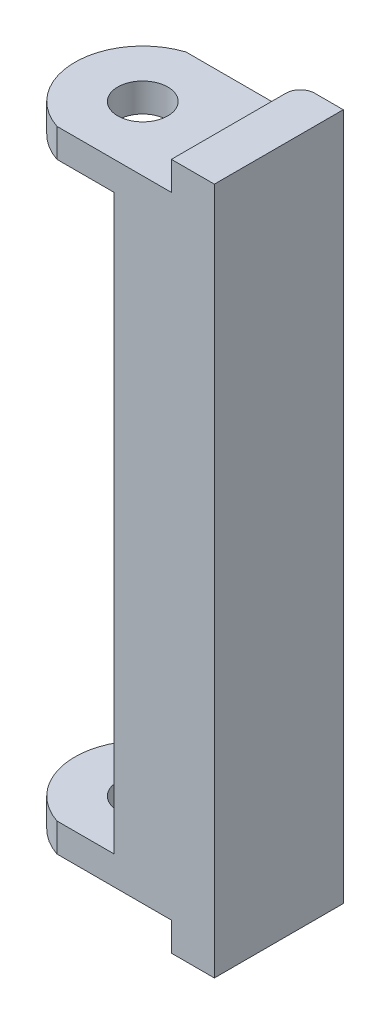
ISO-10303-21;
HEADER;
FILE_DESCRIPTION(('STEP AP214'),'2;1');
FILE_NAME('part.step','',(''),(''),'','','');
FILE_SCHEMA(('AUTOMOTIVE_DESIGN { 1 0 10303 214 1 1 1 1 }'));
ENDSEC;
DATA;
#1=APPLICATION_CONTEXT('core data for automotive mechanical design processes');
#2=APPLICATION_PROTOCOL_DEFINITION('international standard','automotive_design',2000,#1);
#3=PRODUCT_CONTEXT('',#1,'mechanical');
#4=PRODUCT('Part','Part','',(#3));
#5=PRODUCT_RELATED_PRODUCT_CATEGORY('part','',(#4));
#6=PRODUCT_DEFINITION_FORMATION('','',#4);
#7=PRODUCT_DEFINITION_CONTEXT('part definition',#1,'design');
#8=PRODUCT_DEFINITION('design','',#6,#7);
#9=PRODUCT_DEFINITION_SHAPE('','',#8);
#10=(LENGTH_UNIT() NAMED_UNIT(*) SI_UNIT(.MILLI.,.METRE.));
#11=(NAMED_UNIT(*) PLANE_ANGLE_UNIT() SI_UNIT($,.RADIAN.));
#12=(NAMED_UNIT(*) SI_UNIT($,.STERADIAN.) SOLID_ANGLE_UNIT());
#13=UNCERTAINTY_MEASURE_WITH_UNIT(LENGTH_MEASURE(1.E-05),#10,'distance_accuracy_value','');
#14=(GEOMETRIC_REPRESENTATION_CONTEXT(3) GLOBAL_UNCERTAINTY_ASSIGNED_CONTEXT((#13)) GLOBAL_UNIT_ASSIGNED_CONTEXT((#10,
#11,#12)) REPRESENTATION_CONTEXT('',''));
#15=CARTESIAN_POINT('',(0.,0.,0.));
#16=DIRECTION('',(0.,0.,1.));
#17=DIRECTION('',(1.,0.,0.));
#18=AXIS2_PLACEMENT_3D('',#15,#16,#17);
#19=CARTESIAN_POINT('',(0.,2.,0.));
#20=DIRECTION('',(0.,1.,0.));
#21=DIRECTION('',(0.,0.,1.));
#22=AXIS2_PLACEMENT_3D('',#19,#20,#21);
#23=PLANE('',#22);
#24=CARTESIAN_POINT('',(-2.5,2.,0.));
#25=DIRECTION('',(0.,1.,0.));
#26=DIRECTION('',(0.,0.,1.));
#27=AXIS2_PLACEMENT_3D('',#24,#25,#26);
#28=CIRCLE('',#27,1.75);
#29=CARTESIAN_POINT('',(-2.5,2.,1.75));
#30=VERTEX_POINT('',#29);
#31=EDGE_CURVE('E298',#30,#30,#28,.T.);
#32=ORIENTED_EDGE('',*,*,#31,.F.);
#33=EDGE_LOOP('',(#32));
#34=FACE_BOUND('',#33,.T.);
#35=DIRECTION('',(0.,0.,1.));
#36=VECTOR('',#35,1.);
#37=CARTESIAN_POINT('',(4.,2.,0.));
#38=LINE('',#37,#36);
#39=CARTESIAN_POINT('',(4.,2.,-3.5));
#40=VERTEX_POINT('',#39);
#41=CARTESIAN_POINT('',(4.,2.,4.5));
#42=VERTEX_POINT('',#41);
#43=EDGE_CURVE('E103',#40,#42,#38,.T.);
#44=ORIENTED_EDGE('',*,*,#43,.F.);
#45=CARTESIAN_POINT('',(5.,2.,-3.5));
#46=DIRECTION('',(0.,1.,0.));
#47=DIRECTION('',(0.,0.,1.));
#48=AXIS2_PLACEMENT_3D('',#45,#46,#47);
#49=CIRCLE('',#48,1.);
#50=CARTESIAN_POINT('',(5.,2.,-4.5));
#51=VERTEX_POINT('',#50);
#52=EDGE_CURVE('E12',#40,#51,#49,.F.);
#53=ORIENTED_EDGE('',*,*,#52,.T.);
#54=DIRECTION('',(1.,0.,0.));
#55=VECTOR('',#54,1.);
#56=CARTESIAN_POINT('',(0.,2.,-4.5));
#57=LINE('',#56,#55);
#58=CARTESIAN_POINT('',(-3.99100808545272,2.,-4.5));
#59=VERTEX_POINT('',#58);
#60=EDGE_CURVE('E293',#59,#51,#57,.T.);
#61=ORIENTED_EDGE('',*,*,#60,.F.);
#62=CARTESIAN_POINT('',(-2.5,2.,0.));
#63=DIRECTION('',(0.,1.,0.));
#64=DIRECTION('',(0.,0.,1.));
#65=AXIS2_PLACEMENT_3D('',#62,#63,#64);
#66=CIRCLE('',#65,4.74058067233175);
#67=CARTESIAN_POINT('',(-3.99100808545272,2.,4.5));
#68=VERTEX_POINT('',#67);
#69=EDGE_CURVE('E296',#59,#68,#66,.T.);
#70=ORIENTED_EDGE('',*,*,#69,.T.);
#71=DIRECTION('',(1.,0.,0.));
#72=VECTOR('',#71,1.);
#73=CARTESIAN_POINT('',(0.,2.,4.5));
#74=LINE('',#73,#72);
#75=EDGE_CURVE('E291',#68,#42,#74,.T.);
#76=ORIENTED_EDGE('',*,*,#75,.T.);
#77=EDGE_LOOP('',(#44,#53,#61,#70,#76));
#78=FACE_BOUND('',#77,.T.);
#79=ADVANCED_FACE('F95',(#34,#78),#23,.T.);
#80=CARTESIAN_POINT('',(0.,0.,0.));
#81=DIRECTION('',(0.,1.,0.));
#82=DIRECTION('',(0.,0.,1.));
#83=AXIS2_PLACEMENT_3D('',#80,#81,#82);
#84=PLANE('',#83);
#85=CARTESIAN_POINT('',(-2.5,0.,0.));
#86=DIRECTION('',(0.,1.,0.));
#87=DIRECTION('',(0.,0.,1.));
#88=AXIS2_PLACEMENT_3D('',#85,#86,#87);
#89=CIRCLE('',#88,1.75);
#90=CARTESIAN_POINT('',(-2.5,0.,1.75));
#91=VERTEX_POINT('',#90);
#92=EDGE_CURVE('E294',#91,#91,#89,.T.);
#93=ORIENTED_EDGE('',*,*,#92,.T.);
#94=EDGE_LOOP('',(#93));
#95=FACE_BOUND('',#94,.T.);
#96=DIRECTION('',(1.,0.,0.));
#97=VECTOR('',#96,1.);
#98=CARTESIAN_POINT('',(0.,0.,-4.5));
#99=LINE('',#98,#97);
#100=CARTESIAN_POINT('',(-3.99100808545272,0.,-4.5));
#101=VERTEX_POINT('',#100);
#102=CARTESIAN_POINT('',(0.00449595727363902,0.,-4.5));
#103=VERTEX_POINT('',#102);
#104=EDGE_CURVE('E305',#101,#103,#99,.T.);
#105=ORIENTED_EDGE('',*,*,#104,.T.);
#106=CARTESIAN_POINT('',(-2.5,0.,0.));
#107=DIRECTION('',(0.,1.,0.));
#108=DIRECTION('',(0.,0.,1.));
#109=AXIS2_PLACEMENT_3D('',#106,#107,#108);
#110=CIRCLE('',#109,5.15);
#111=CARTESIAN_POINT('',(0.00449595727364032,0.,4.5));
#112=VERTEX_POINT('',#111);
#113=EDGE_CURVE('E284',#103,#112,#110,.F.);
#114=ORIENTED_EDGE('',*,*,#113,.T.);
#115=DIRECTION('',(1.,0.,0.));
#116=VECTOR('',#115,1.);
#117=CARTESIAN_POINT('',(0.,0.,4.5));
#118=LINE('',#117,#116);
#119=CARTESIAN_POINT('',(-3.99100808545272,0.,4.5));
#120=VERTEX_POINT('',#119);
#121=EDGE_CURVE('E302',#120,#112,#118,.T.);
#122=ORIENTED_EDGE('',*,*,#121,.F.);
#123=CARTESIAN_POINT('',(-2.5,0.,0.));
#124=DIRECTION('',(0.,1.,0.));
#125=DIRECTION('',(0.,0.,1.));
#126=AXIS2_PLACEMENT_3D('',#123,#124,#125);
#127=CIRCLE('',#126,4.74058067233175);
#128=EDGE_CURVE('E309',#101,#120,#127,.T.);
#129=ORIENTED_EDGE('',*,*,#128,.F.);
#130=EDGE_LOOP('',(#105,#114,#122,#129));
#131=FACE_BOUND('',#130,.T.);
#132=ADVANCED_FACE('F341',(#95,#131),#84,.F.);
#133=CARTESIAN_POINT('',(-2.5,2.,0.));
#134=DIRECTION('',(0.,-1.,0.));
#135=DIRECTION('',(0.,0.,-1.));
#136=AXIS2_PLACEMENT_3D('',#133,#134,#135);
#137=CYLINDRICAL_SURFACE('',#136,1.75);
#138=ORIENTED_EDGE('',*,*,#31,.T.);
#139=EDGE_LOOP('',(#138));
#140=FACE_BOUND('',#139,.T.);
#141=ORIENTED_EDGE('',*,*,#92,.F.);
#142=EDGE_LOOP('',(#141));
#143=FACE_BOUND('',#142,.T.);
#144=ADVANCED_FACE('F363',(#140,#143),#137,.F.);
#145=CARTESIAN_POINT('',(0.,2.,-4.5));
#146=DIRECTION('',(0.,0.,-1.));
#147=DIRECTION('',(-1.,0.,0.));
#148=AXIS2_PLACEMENT_3D('',#145,#146,#147);
#149=PLANE('',#148);
#150=ORIENTED_EDGE('',*,*,#60,.T.);
#151=DIRECTION('',(0.,-1.,0.));
#152=VECTOR('',#151,1.);
#153=CARTESIAN_POINT('',(5.,4.,-4.5));
#154=LINE('',#153,#152);
#155=CARTESIAN_POINT('',(5.,4.,-4.5));
#156=VERTEX_POINT('',#155);
#157=EDGE_CURVE('E281',#156,#51,#154,.T.);
#158=ORIENTED_EDGE('',*,*,#157,.F.);
#159=DIRECTION('',(-1.,0.,0.));
#160=VECTOR('',#159,1.);
#161=CARTESIAN_POINT('',(0.,4.,-4.5));
#162=LINE('',#161,#160);
#163=CARTESIAN_POINT('',(7.,4.,-4.5));
#164=VERTEX_POINT('',#163);
#165=EDGE_CURVE('E261',#164,#156,#162,.T.);
#166=ORIENTED_EDGE('',*,*,#165,.F.);
#167=DIRECTION('',(0.,-1.,0.));
#168=VECTOR('',#167,1.);
#169=CARTESIAN_POINT('',(7.,2.,-4.5));
#170=LINE('',#169,#168);
#171=CARTESIAN_POINT('',(7.,-44.,-4.5));
#172=VERTEX_POINT('',#171);
#173=EDGE_CURVE('E216',#164,#172,#170,.T.);
#174=ORIENTED_EDGE('',*,*,#173,.T.);
#175=DIRECTION('',(-1.,0.,0.));
#176=VECTOR('',#175,1.);
#177=CARTESIAN_POINT('',(0.,-44.,-4.5));
#178=LINE('',#177,#176);
#179=CARTESIAN_POINT('',(5.,-44.,-4.5));
#180=VERTEX_POINT('',#179);
#181=EDGE_CURVE('E197',#172,#180,#178,.T.);
#182=ORIENTED_EDGE('',*,*,#181,.T.);
#183=DIRECTION('',(0.,1.,0.));
#184=VECTOR('',#183,1.);
#185=CARTESIAN_POINT('',(5.,-44.,-4.5));
#186=LINE('',#185,#184);
#187=CARTESIAN_POINT('',(5.,-42.,-4.5));
#188=VERTEX_POINT('',#187);
#189=EDGE_CURVE('E204',#180,#188,#186,.T.);
#190=ORIENTED_EDGE('',*,*,#189,.T.);
#191=DIRECTION('',(1.,0.,0.));
#192=VECTOR('',#191,1.);
#193=CARTESIAN_POINT('',(0.,-42.,-4.5));
#194=LINE('',#193,#192);
#195=CARTESIAN_POINT('',(-3.99100808545272,-42.,-4.5));
#196=VERTEX_POINT('',#195);
#197=EDGE_CURVE('E234',#196,#188,#194,.T.);
#198=ORIENTED_EDGE('',*,*,#197,.F.);
#199=DIRECTION('',(0.,1.,0.));
#200=VECTOR('',#199,1.);
#201=CARTESIAN_POINT('',(-3.99100808545272,-42.,-4.5));
#202=LINE('',#201,#200);
#203=CARTESIAN_POINT('',(-3.99100808545272,-40.,-4.5));
#204=VERTEX_POINT('',#203);
#205=EDGE_CURVE('E255',#196,#204,#202,.T.);
#206=ORIENTED_EDGE('',*,*,#205,.T.);
#207=DIRECTION('',(1.,0.,0.));
#208=VECTOR('',#207,1.);
#209=CARTESIAN_POINT('',(0.,-40.,-4.5));
#210=LINE('',#209,#208);
#211=CARTESIAN_POINT('',(0.00449595727363902,-40.,-4.5));
#212=VERTEX_POINT('',#211);
#213=EDGE_CURVE('E246',#204,#212,#210,.T.);
#214=ORIENTED_EDGE('',*,*,#213,.T.);
#215=DIRECTION('',(0.,1.,0.));
#216=VECTOR('',#215,1.);
#217=CARTESIAN_POINT('',(0.00449595727363902,-20.,-4.5));
#218=LINE('',#217,#216);
#219=EDGE_CURVE('E287',#212,#103,#218,.T.);
#220=ORIENTED_EDGE('',*,*,#219,.T.);
#221=ORIENTED_EDGE('',*,*,#104,.F.);
#222=DIRECTION('',(0.,-1.,0.));
#223=VECTOR('',#222,1.);
#224=CARTESIAN_POINT('',(-3.99100808545272,2.,-4.5));
#225=LINE('',#224,#223);
#226=EDGE_CURVE('E315',#59,#101,#225,.T.);
#227=ORIENTED_EDGE('',*,*,#226,.F.);
#228=EDGE_LOOP('',(#150,#158,#166,#174,#182,#190,#198,#206,#214,#220,#221,#227));
#229=FACE_BOUND('',#228,.T.);
#230=ADVANCED_FACE('F214',(#229),#149,.T.);
#231=CARTESIAN_POINT('',(-2.5,2.,0.));
#232=DIRECTION('',(0.,-1.,0.));
#233=DIRECTION('',(0.,0.,-1.));
#234=AXIS2_PLACEMENT_3D('',#231,#232,#233);
#235=CYLINDRICAL_SURFACE('',#234,4.74058067233175);
#236=ORIENTED_EDGE('',*,*,#128,.T.);
#237=DIRECTION('',(0.,-1.,0.));
#238=VECTOR('',#237,1.);
#239=CARTESIAN_POINT('',(-3.99100808545272,2.,4.5));
#240=LINE('',#239,#238);
#241=EDGE_CURVE('E301',#68,#120,#240,.T.);
#242=ORIENTED_EDGE('',*,*,#241,.F.);
#243=ORIENTED_EDGE('',*,*,#69,.F.);
#244=ORIENTED_EDGE('',*,*,#226,.T.);
#245=EDGE_LOOP('',(#236,#242,#243,#244));
#246=FACE_BOUND('',#245,.T.);
#247=ADVANCED_FACE('F337',(#246),#235,.T.);
#248=CARTESIAN_POINT('',(0.,2.,4.5));
#249=DIRECTION('',(0.,0.,-1.));
#250=DIRECTION('',(-1.,0.,0.));
#251=AXIS2_PLACEMENT_3D('',#248,#249,#250);
#252=PLANE('',#251);
#253=DIRECTION('',(0.,-1.,0.));
#254=VECTOR('',#253,1.);
#255=CARTESIAN_POINT('',(4.,4.,4.5));
#256=LINE('',#255,#254);
#257=CARTESIAN_POINT('',(4.,4.,4.5));
#258=VERTEX_POINT('',#257);
#259=EDGE_CURVE('E275',#258,#42,#256,.T.);
#260=ORIENTED_EDGE('',*,*,#259,.T.);
#261=ORIENTED_EDGE('',*,*,#75,.F.);
#262=ORIENTED_EDGE('',*,*,#241,.T.);
#263=ORIENTED_EDGE('',*,*,#121,.T.);
#264=DIRECTION('',(0.,1.,0.));
#265=VECTOR('',#264,1.);
#266=CARTESIAN_POINT('',(0.00449595727364032,-20.,4.5));
#267=LINE('',#266,#265);
#268=CARTESIAN_POINT('',(0.00449595727364032,-40.,4.5));
#269=VERTEX_POINT('',#268);
#270=EDGE_CURVE('E288',#269,#112,#267,.T.);
#271=ORIENTED_EDGE('',*,*,#270,.F.);
#272=DIRECTION('',(1.,0.,0.));
#273=VECTOR('',#272,1.);
#274=CARTESIAN_POINT('',(0.,-40.,4.5));
#275=LINE('',#274,#273);
#276=CARTESIAN_POINT('',(-3.99100808545272,-40.,4.5));
#277=VERTEX_POINT('',#276);
#278=EDGE_CURVE('E230',#277,#269,#275,.T.);
#279=ORIENTED_EDGE('',*,*,#278,.F.);
#280=DIRECTION('',(0.,1.,0.));
#281=VECTOR('',#280,1.);
#282=CARTESIAN_POINT('',(-3.99100808545272,-42.,4.5));
#283=LINE('',#282,#281);
#284=CARTESIAN_POINT('',(-3.99100808545272,-42.,4.5));
#285=VERTEX_POINT('',#284);
#286=EDGE_CURVE('E243',#285,#277,#283,.T.);
#287=ORIENTED_EDGE('',*,*,#286,.F.);
#288=DIRECTION('',(1.,0.,0.));
#289=VECTOR('',#288,1.);
#290=CARTESIAN_POINT('',(0.,-42.,4.5));
#291=LINE('',#290,#289);
#292=CARTESIAN_POINT('',(4.,-42.,4.5));
#293=VERTEX_POINT('',#292);
#294=EDGE_CURVE('E231',#285,#293,#291,.T.);
#295=ORIENTED_EDGE('',*,*,#294,.T.);
#296=DIRECTION('',(0.,1.,0.));
#297=VECTOR('',#296,1.);
#298=CARTESIAN_POINT('',(4.,-44.,4.5));
#299=LINE('',#298,#297);
#300=CARTESIAN_POINT('',(4.,-44.,4.5));
#301=VERTEX_POINT('',#300);
#302=EDGE_CURVE('E225',#301,#293,#299,.T.);
#303=ORIENTED_EDGE('',*,*,#302,.F.);
#304=DIRECTION('',(-1.,0.,0.));
#305=VECTOR('',#304,1.);
#306=CARTESIAN_POINT('',(0.,-44.,4.5));
#307=LINE('',#306,#305);
#308=CARTESIAN_POINT('',(7.,-44.,4.5));
#309=VERTEX_POINT('',#308);
#310=EDGE_CURVE('E221',#309,#301,#307,.T.);
#311=ORIENTED_EDGE('',*,*,#310,.F.);
#312=DIRECTION('',(0.,-1.,0.));
#313=VECTOR('',#312,1.);
#314=CARTESIAN_POINT('',(7.,2.,4.5));
#315=LINE('',#314,#313);
#316=CARTESIAN_POINT('',(7.,4.,4.5));
#317=VERTEX_POINT('',#316);
#318=EDGE_CURVE('E306',#317,#309,#315,.T.);
#319=ORIENTED_EDGE('',*,*,#318,.F.);
#320=DIRECTION('',(-1.,0.,0.));
#321=VECTOR('',#320,1.);
#322=CARTESIAN_POINT('',(0.,4.,4.5));
#323=LINE('',#322,#321);
#324=EDGE_CURVE('E269',#317,#258,#323,.T.);
#325=ORIENTED_EDGE('',*,*,#324,.T.);
#326=EDGE_LOOP('',(#260,#261,#262,#263,#271,#279,#287,#295,#303,#311,#319,#325));
#327=FACE_BOUND('',#326,.T.);
#328=ADVANCED_FACE('F324',(#327),#252,.F.);
#329=CARTESIAN_POINT('',(7.,2.,4.5));
#330=DIRECTION('',(-1.,0.,0.));
#331=DIRECTION('',(0.,0.,1.));
#332=AXIS2_PLACEMENT_3D('',#329,#330,#331);
#333=PLANE('',#332);
#334=ORIENTED_EDGE('',*,*,#318,.T.);
#335=DIRECTION('',(0.,0.,-1.));
#336=VECTOR('',#335,1.);
#337=CARTESIAN_POINT('',(7.,-44.,0.));
#338=LINE('',#337,#336);
#339=EDGE_CURVE('E223',#309,#172,#338,.T.);
#340=ORIENTED_EDGE('',*,*,#339,.T.);
#341=ORIENTED_EDGE('',*,*,#173,.F.);
#342=DIRECTION('',(0.,0.,-1.));
#343=VECTOR('',#342,1.);
#344=CARTESIAN_POINT('',(7.,4.,0.));
#345=LINE('',#344,#343);
#346=EDGE_CURVE('E272',#317,#164,#345,.T.);
#347=ORIENTED_EDGE('',*,*,#346,.F.);
#348=EDGE_LOOP('',(#334,#340,#341,#347));
#349=FACE_BOUND('',#348,.T.);
#350=ADVANCED_FACE('F97',(#349),#333,.F.);
#351=CARTESIAN_POINT('',(-2.5,-20.,0.));
#352=DIRECTION('',(0.,1.,0.));
#353=DIRECTION('',(0.,0.,1.));
#354=AXIS2_PLACEMENT_3D('',#351,#352,#353);
#355=CYLINDRICAL_SURFACE('',#354,5.15);
#356=ORIENTED_EDGE('',*,*,#113,.F.);
#357=ORIENTED_EDGE('',*,*,#219,.F.);
#358=CARTESIAN_POINT('',(-2.5,-40.,0.));
#359=DIRECTION('',(0.,1.,0.));
#360=DIRECTION('',(0.,0.,1.));
#361=AXIS2_PLACEMENT_3D('',#358,#359,#360);
#362=CIRCLE('',#361,5.15);
#363=EDGE_CURVE('E211',#212,#269,#362,.F.);
#364=ORIENTED_EDGE('',*,*,#363,.T.);
#365=ORIENTED_EDGE('',*,*,#270,.T.);
#366=EDGE_LOOP('',(#356,#357,#364,#365));
#367=FACE_BOUND('',#366,.T.);
#368=ADVANCED_FACE('F344',(#367),#355,.F.);
#369=CARTESIAN_POINT('',(5.,4.,-3.5));
#370=DIRECTION('',(0.,-1.,0.));
#371=DIRECTION('',(0.,0.,-1.));
#372=AXIS2_PLACEMENT_3D('',#369,#370,#371);
#373=CYLINDRICAL_SURFACE('',#372,1.);
#374=ORIENTED_EDGE('',*,*,#52,.F.);
#375=DIRECTION('',(0.,-1.,0.));
#376=VECTOR('',#375,1.);
#377=CARTESIAN_POINT('',(4.,4.,-3.5));
#378=LINE('',#377,#376);
#379=CARTESIAN_POINT('',(4.,4.,-3.5));
#380=VERTEX_POINT('',#379);
#381=EDGE_CURVE('E278',#380,#40,#378,.T.);
#382=ORIENTED_EDGE('',*,*,#381,.F.);
#383=CARTESIAN_POINT('',(5.,4.,-3.5));
#384=DIRECTION('',(0.,1.,0.));
#385=DIRECTION('',(0.,0.,1.));
#386=AXIS2_PLACEMENT_3D('',#383,#384,#385);
#387=CIRCLE('',#386,1.);
#388=EDGE_CURVE('E264',#156,#380,#387,.T.);
#389=ORIENTED_EDGE('',*,*,#388,.F.);
#390=ORIENTED_EDGE('',*,*,#157,.T.);
#391=EDGE_LOOP('',(#374,#382,#389,#390));
#392=FACE_BOUND('',#391,.T.);
#393=ADVANCED_FACE('F332',(#392),#373,.T.);
#394=CARTESIAN_POINT('',(4.,4.,0.));
#395=DIRECTION('',(-1.,0.,0.));
#396=DIRECTION('',(0.,0.,1.));
#397=AXIS2_PLACEMENT_3D('',#394,#395,#396);
#398=PLANE('',#397);
#399=ORIENTED_EDGE('',*,*,#381,.T.);
#400=ORIENTED_EDGE('',*,*,#43,.T.);
#401=ORIENTED_EDGE('',*,*,#259,.F.);
#402=DIRECTION('',(0.,0.,-1.));
#403=VECTOR('',#402,1.);
#404=CARTESIAN_POINT('',(4.,4.,0.));
#405=LINE('',#404,#403);
#406=EDGE_CURVE('E266',#258,#380,#405,.T.);
#407=ORIENTED_EDGE('',*,*,#406,.T.);
#408=EDGE_LOOP('',(#399,#400,#401,#407));
#409=FACE_BOUND('',#408,.T.);
#410=ADVANCED_FACE('F319',(#409),#398,.T.);
#411=CARTESIAN_POINT('',(0.,4.,0.));
#412=DIRECTION('',(0.,1.,0.));
#413=DIRECTION('',(0.,0.,1.));
#414=AXIS2_PLACEMENT_3D('',#411,#412,#413);
#415=PLANE('',#414);
#416=ORIENTED_EDGE('',*,*,#165,.T.);
#417=ORIENTED_EDGE('',*,*,#388,.T.);
#418=ORIENTED_EDGE('',*,*,#406,.F.);
#419=ORIENTED_EDGE('',*,*,#324,.F.);
#420=ORIENTED_EDGE('',*,*,#346,.T.);
#421=EDGE_LOOP('',(#416,#417,#418,#419,#420));
#422=FACE_BOUND('',#421,.T.);
#423=ADVANCED_FACE('F329',(#422),#415,.T.);
#424=CARTESIAN_POINT('',(0.,-42.,0.));
#425=DIRECTION('',(0.,-1.,0.));
#426=DIRECTION('',(0.,0.,1.));
#427=AXIS2_PLACEMENT_3D('',#424,#425,#426);
#428=PLANE('',#427);
#429=CARTESIAN_POINT('',(-2.5,-42.,0.));
#430=DIRECTION('',(0.,1.,0.));
#431=DIRECTION('',(0.,0.,1.));
#432=AXIS2_PLACEMENT_3D('',#429,#430,#431);
#433=CIRCLE('',#432,1.75);
#434=CARTESIAN_POINT('',(-2.5,-42.,1.75));
#435=VERTEX_POINT('',#434);
#436=EDGE_CURVE('E240',#435,#435,#433,.T.);
#437=ORIENTED_EDGE('',*,*,#436,.T.);
#438=EDGE_LOOP('',(#437));
#439=FACE_BOUND('',#438,.T.);
#440=DIRECTION('',(0.,0.,1.));
#441=VECTOR('',#440,1.);
#442=CARTESIAN_POINT('',(4.,-42.,0.));
#443=LINE('',#442,#441);
#444=CARTESIAN_POINT('',(4.,-42.,-3.5));
#445=VERTEX_POINT('',#444);
#446=EDGE_CURVE('E257',#445,#293,#443,.T.);
#447=ORIENTED_EDGE('',*,*,#446,.T.);
#448=ORIENTED_EDGE('',*,*,#294,.F.);
#449=CARTESIAN_POINT('',(-2.5,-42.,0.));
#450=DIRECTION('',(0.,1.,0.));
#451=DIRECTION('',(0.,0.,1.));
#452=AXIS2_PLACEMENT_3D('',#449,#450,#451);
#453=CIRCLE('',#452,4.74058067233175);
#454=EDGE_CURVE('E237',#196,#285,#453,.T.);
#455=ORIENTED_EDGE('',*,*,#454,.F.);
#456=ORIENTED_EDGE('',*,*,#197,.T.);
#457=CARTESIAN_POINT('',(5.,-42.,-3.5));
#458=DIRECTION('',(0.,1.,0.));
#459=DIRECTION('',(0.,0.,1.));
#460=AXIS2_PLACEMENT_3D('',#457,#458,#459);
#461=CIRCLE('',#460,1.);
#462=EDGE_CURVE('E207',#445,#188,#461,.F.);
#463=ORIENTED_EDGE('',*,*,#462,.F.);
#464=EDGE_LOOP('',(#447,#448,#455,#456,#463));
#465=FACE_BOUND('',#464,.T.);
#466=ADVANCED_FACE('F356',(#439,#465),#428,.T.);
#467=CARTESIAN_POINT('',(0.,-40.,0.));
#468=DIRECTION('',(0.,-1.,0.));
#469=DIRECTION('',(0.,0.,1.));
#470=AXIS2_PLACEMENT_3D('',#467,#468,#469);
#471=PLANE('',#470);
#472=CARTESIAN_POINT('',(-2.5,-40.,0.));
#473=DIRECTION('',(0.,1.,0.));
#474=DIRECTION('',(0.,0.,1.));
#475=AXIS2_PLACEMENT_3D('',#472,#473,#474);
#476=CIRCLE('',#475,1.75);
#477=CARTESIAN_POINT('',(-2.5,-40.,1.75));
#478=VERTEX_POINT('',#477);
#479=EDGE_CURVE('E235',#478,#478,#476,.T.);
#480=ORIENTED_EDGE('',*,*,#479,.F.);
#481=EDGE_LOOP('',(#480));
#482=FACE_BOUND('',#481,.T.);
#483=ORIENTED_EDGE('',*,*,#213,.F.);
#484=CARTESIAN_POINT('',(-2.5,-40.,0.));
#485=DIRECTION('',(0.,1.,0.));
#486=DIRECTION('',(0.,0.,1.));
#487=AXIS2_PLACEMENT_3D('',#484,#485,#486);
#488=CIRCLE('',#487,4.74058067233175);
#489=EDGE_CURVE('E249',#204,#277,#488,.T.);
#490=ORIENTED_EDGE('',*,*,#489,.T.);
#491=ORIENTED_EDGE('',*,*,#278,.T.);
#492=ORIENTED_EDGE('',*,*,#363,.F.);
#493=EDGE_LOOP('',(#483,#490,#491,#492));
#494=FACE_BOUND('',#493,.T.);
#495=ADVANCED_FACE('F350',(#482,#494),#471,.F.);
#496=CARTESIAN_POINT('',(-2.5,-42.,0.));
#497=DIRECTION('',(0.,1.,0.));
#498=DIRECTION('',(0.,0.,-1.));
#499=AXIS2_PLACEMENT_3D('',#496,#497,#498);
#500=CYLINDRICAL_SURFACE('',#499,1.75);
#501=ORIENTED_EDGE('',*,*,#436,.F.);
#502=EDGE_LOOP('',(#501));
#503=FACE_BOUND('',#502,.T.);
#504=ORIENTED_EDGE('',*,*,#479,.T.);
#505=EDGE_LOOP('',(#504));
#506=FACE_BOUND('',#505,.T.);
#507=ADVANCED_FACE('F437',(#503,#506),#500,.F.);
#508=CARTESIAN_POINT('',(-2.5,-42.,0.));
#509=DIRECTION('',(0.,1.,0.));
#510=DIRECTION('',(0.,0.,-1.));
#511=AXIS2_PLACEMENT_3D('',#508,#509,#510);
#512=CYLINDRICAL_SURFACE('',#511,4.74058067233175);
#513=ORIENTED_EDGE('',*,*,#489,.F.);
#514=ORIENTED_EDGE('',*,*,#205,.F.);
#515=ORIENTED_EDGE('',*,*,#454,.T.);
#516=ORIENTED_EDGE('',*,*,#286,.T.);
#517=EDGE_LOOP('',(#513,#514,#515,#516));
#518=FACE_BOUND('',#517,.T.);
#519=ADVANCED_FACE('F352',(#518),#512,.T.);
#520=CARTESIAN_POINT('',(5.,-44.,-3.5));
#521=DIRECTION('',(0.,1.,0.));
#522=DIRECTION('',(0.,0.,-1.));
#523=AXIS2_PLACEMENT_3D('',#520,#521,#522);
#524=CYLINDRICAL_SURFACE('',#523,1.);
#525=ORIENTED_EDGE('',*,*,#462,.T.);
#526=ORIENTED_EDGE('',*,*,#189,.F.);
#527=CARTESIAN_POINT('',(5.,-44.,-3.5));
#528=DIRECTION('',(0.,1.,0.));
#529=DIRECTION('',(0.,0.,1.));
#530=AXIS2_PLACEMENT_3D('',#527,#528,#529);
#531=CIRCLE('',#530,1.);
#532=CARTESIAN_POINT('',(4.,-44.,-3.5));
#533=VERTEX_POINT('',#532);
#534=EDGE_CURVE('E192',#180,#533,#531,.T.);
#535=ORIENTED_EDGE('',*,*,#534,.T.);
#536=DIRECTION('',(0.,1.,0.));
#537=VECTOR('',#536,1.);
#538=CARTESIAN_POINT('',(4.,-44.,-3.5));
#539=LINE('',#538,#537);
#540=EDGE_CURVE('E212',#533,#445,#539,.T.);
#541=ORIENTED_EDGE('',*,*,#540,.T.);
#542=EDGE_LOOP('',(#525,#526,#535,#541));
#543=FACE_BOUND('',#542,.T.);
#544=ADVANCED_FACE('F205',(#543),#524,.T.);
#545=CARTESIAN_POINT('',(4.,-44.,0.));
#546=DIRECTION('',(-1.,0.,0.));
#547=DIRECTION('',(0.,0.,1.));
#548=AXIS2_PLACEMENT_3D('',#545,#546,#547);
#549=PLANE('',#548);
#550=ORIENTED_EDGE('',*,*,#540,.F.);
#551=DIRECTION('',(0.,0.,-1.));
#552=VECTOR('',#551,1.);
#553=CARTESIAN_POINT('',(4.,-44.,0.));
#554=LINE('',#553,#552);
#555=EDGE_CURVE('E199',#301,#533,#554,.T.);
#556=ORIENTED_EDGE('',*,*,#555,.F.);
#557=ORIENTED_EDGE('',*,*,#302,.T.);
#558=ORIENTED_EDGE('',*,*,#446,.F.);
#559=EDGE_LOOP('',(#550,#556,#557,#558));
#560=FACE_BOUND('',#559,.T.);
#561=ADVANCED_FACE('F360',(#560),#549,.T.);
#562=CARTESIAN_POINT('',(0.,-44.,0.));
#563=DIRECTION('',(0.,-1.,0.));
#564=DIRECTION('',(0.,0.,1.));
#565=AXIS2_PLACEMENT_3D('',#562,#563,#564);
#566=PLANE('',#565);
#567=ORIENTED_EDGE('',*,*,#181,.F.);
#568=ORIENTED_EDGE('',*,*,#339,.F.);
#569=ORIENTED_EDGE('',*,*,#310,.T.);
#570=ORIENTED_EDGE('',*,*,#555,.T.);
#571=ORIENTED_EDGE('',*,*,#534,.F.);
#572=EDGE_LOOP('',(#567,#568,#569,#570,#571));
#573=FACE_BOUND('',#572,.T.);
#574=ADVANCED_FACE('F194',(#573),#566,.T.);
#575=CLOSED_SHELL('',(#79,#132,#144,#230,#247,#328,#350,#368,#393,#410,#423,#466,#495,#507,#519,
#544,#561,#574));
#576=MANIFOLD_SOLID_BREP('B2',#575);
#577=ADVANCED_BREP_SHAPE_REPRESENTATION('',(#18,#576),#14);
#578=SHAPE_DEFINITION_REPRESENTATION(#9,#577);
ENDSEC;
END-ISO-10303-21;
